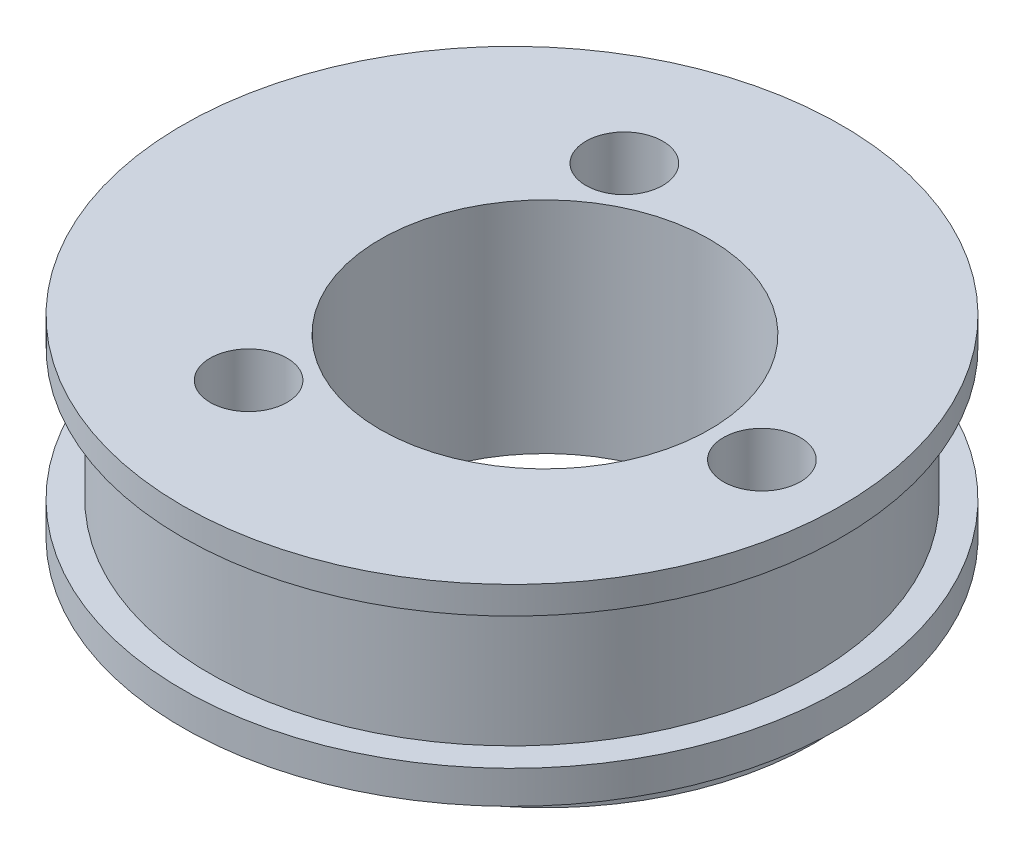
ISO-10303-21;
HEADER;
FILE_DESCRIPTION(('STEP AP214'),'2;1');
FILE_NAME('part.step','',(''),(''),'','','');
FILE_SCHEMA(('AUTOMOTIVE_DESIGN { 1 0 10303 214 1 1 1 1 }'));
ENDSEC;
DATA;
#1=APPLICATION_CONTEXT('core data for automotive mechanical design processes');
#2=APPLICATION_PROTOCOL_DEFINITION('international standard','automotive_design',2000,#1);
#3=PRODUCT_CONTEXT('',#1,'mechanical');
#4=PRODUCT('Part','Part','',(#3));
#5=PRODUCT_RELATED_PRODUCT_CATEGORY('part','',(#4));
#6=PRODUCT_DEFINITION_FORMATION('','',#4);
#7=PRODUCT_DEFINITION_CONTEXT('part definition',#1,'design');
#8=PRODUCT_DEFINITION('design','',#6,#7);
#9=PRODUCT_DEFINITION_SHAPE('','',#8);
#10=(LENGTH_UNIT() NAMED_UNIT(*) SI_UNIT(.MILLI.,.METRE.));
#11=(NAMED_UNIT(*) PLANE_ANGLE_UNIT() SI_UNIT($,.RADIAN.));
#12=(NAMED_UNIT(*) SI_UNIT($,.STERADIAN.) SOLID_ANGLE_UNIT());
#13=UNCERTAINTY_MEASURE_WITH_UNIT(LENGTH_MEASURE(1.E-05),#10,'distance_accuracy_value','');
#14=(GEOMETRIC_REPRESENTATION_CONTEXT(3) GLOBAL_UNCERTAINTY_ASSIGNED_CONTEXT((#13)) GLOBAL_UNIT_ASSIGNED_CONTEXT((#10,
#11,#12)) REPRESENTATION_CONTEXT('',''));
#15=CARTESIAN_POINT('',(0.,0.,0.));
#16=DIRECTION('',(0.,0.,1.));
#17=DIRECTION('',(1.,0.,0.));
#18=AXIS2_PLACEMENT_3D('',#15,#16,#17);
#19=CARTESIAN_POINT('',(0.,3.,0.));
#20=DIRECTION('',(0.,-1.,0.));
#21=DIRECTION('',(0.,0.,-1.));
#22=AXIS2_PLACEMENT_3D('',#19,#20,#21);
#23=PLANE('',#22);
#24=CARTESIAN_POINT('',(0.,3.,0.));
#25=DIRECTION('',(0.,-1.,0.));
#26=DIRECTION('',(0.,0.,-1.));
#27=AXIS2_PLACEMENT_3D('',#24,#25,#26);
#28=CIRCLE('',#27,27.5);
#29=CARTESIAN_POINT('',(0.,3.,-27.5));
#30=VERTEX_POINT('',#29);
#31=EDGE_CURVE('E70',#30,#30,#28,.T.);
#32=ORIENTED_EDGE('',*,*,#31,.T.);
#33=EDGE_LOOP('',(#32));
#34=FACE_BOUND('',#33,.T.);
#35=CARTESIAN_POINT('',(0.,3.,0.));
#36=DIRECTION('',(0.,-1.,0.));
#37=DIRECTION('',(0.,0.,-1.));
#38=AXIS2_PLACEMENT_3D('',#35,#36,#37);
#39=CIRCLE('',#38,30.);
#40=CARTESIAN_POINT('',(0.,3.,-30.));
#41=VERTEX_POINT('',#40);
#42=EDGE_CURVE('E58',#41,#41,#39,.T.);
#43=ORIENTED_EDGE('',*,*,#42,.F.);
#44=EDGE_LOOP('',(#43));
#45=FACE_BOUND('',#44,.T.);
#46=ADVANCED_FACE('F41',(#34,#45),#23,.F.);
#47=CARTESIAN_POINT('',(3.,-2.5,0.));
#48=DIRECTION('',(0.,1.,0.));
#49=DIRECTION('',(0.,0.,1.));
#50=AXIS2_PLACEMENT_3D('',#47,#48,#49);
#51=CYLINDRICAL_SURFACE('',#50,24.5);
#52=CARTESIAN_POINT('',(3.,-2.5,0.));
#53=DIRECTION('',(0.,-1.,0.));
#54=DIRECTION('',(0.,0.,-1.));
#55=AXIS2_PLACEMENT_3D('',#52,#53,#54);
#56=CIRCLE('',#55,24.5);
#57=CARTESIAN_POINT('',(3.,-2.5,-24.5));
#58=VERTEX_POINT('',#57);
#59=EDGE_CURVE('E48',#58,#58,#56,.T.);
#60=ORIENTED_EDGE('',*,*,#59,.F.);
#61=EDGE_LOOP('',(#60));
#62=FACE_BOUND('',#61,.T.);
#63=CARTESIAN_POINT('',(3.,0.,0.));
#64=DIRECTION('',(0.,-1.,0.));
#65=DIRECTION('',(0.,0.,-1.));
#66=AXIS2_PLACEMENT_3D('',#63,#64,#65);
#67=CIRCLE('',#66,24.5);
#68=CARTESIAN_POINT('',(3.,0.,-24.5));
#69=VERTEX_POINT('',#68);
#70=EDGE_CURVE('E44',#69,#69,#67,.T.);
#71=ORIENTED_EDGE('',*,*,#70,.T.);
#72=EDGE_LOOP('',(#71));
#73=FACE_BOUND('',#72,.T.);
#74=ADVANCED_FACE('F125',(#62,#73),#51,.T.);
#75=CARTESIAN_POINT('',(0.,-2.5,0.));
#76=DIRECTION('',(0.,-1.,0.));
#77=DIRECTION('',(0.,0.,-1.));
#78=AXIS2_PLACEMENT_3D('',#75,#76,#77);
#79=PLANE('',#78);
#80=CARTESIAN_POINT('',(-6.87499999999996,-2.5,-17.1040017247427));
#81=DIRECTION('',(0.,1.,0.));
#82=DIRECTION('',(0.,0.,1.));
#83=AXIS2_PLACEMENT_3D('',#80,#81,#82);
#84=CIRCLE('',#83,2.);
#85=CARTESIAN_POINT('',(-6.87499999999996,-2.5,-15.1040017247427));
#86=VERTEX_POINT('',#85);
#87=EDGE_CURVE('E61',#86,#86,#84,.T.);
#88=ORIENTED_EDGE('',*,*,#87,.T.);
#89=EDGE_LOOP('',(#88));
#90=FACE_BOUND('',#89,.T.);
#91=CARTESIAN_POINT('',(-6.8750000000002,-2.5,17.1040017247425));
#92=DIRECTION('',(0.,1.,0.));
#93=DIRECTION('',(0.,0.,1.));
#94=AXIS2_PLACEMENT_3D('',#91,#92,#93);
#95=CIRCLE('',#94,2.);
#96=CARTESIAN_POINT('',(-6.8750000000002,-2.5,19.1040017247425));
#97=VERTEX_POINT('',#96);
#98=EDGE_CURVE('E57',#97,#97,#95,.T.);
#99=ORIENTED_EDGE('',*,*,#98,.T.);
#100=EDGE_LOOP('',(#99));
#101=FACE_BOUND('',#100,.T.);
#102=CARTESIAN_POINT('',(22.75,-2.5,1.39413705213259E-13));
#103=DIRECTION('',(0.,1.,0.));
#104=DIRECTION('',(0.,0.,1.));
#105=AXIS2_PLACEMENT_3D('',#102,#103,#104);
#106=CIRCLE('',#105,2.);
#107=CARTESIAN_POINT('',(22.75,-2.5,2.00000000000014));
#108=VERTEX_POINT('',#107);
#109=EDGE_CURVE('E54',#108,#108,#106,.T.);
#110=ORIENTED_EDGE('',*,*,#109,.T.);
#111=EDGE_LOOP('',(#110));
#112=FACE_BOUND('',#111,.T.);
#113=ORIENTED_EDGE('',*,*,#59,.T.);
#114=EDGE_LOOP('',(#113));
#115=FACE_BOUND('',#114,.T.);
#116=CARTESIAN_POINT('',(3.,-2.5,0.));
#117=DIRECTION('',(0.,-1.,0.));
#118=DIRECTION('',(0.,0.,-1.));
#119=AXIS2_PLACEMENT_3D('',#116,#117,#118);
#120=CIRCLE('',#119,15.);
#121=CARTESIAN_POINT('',(3.,-2.5,-15.));
#122=VERTEX_POINT('',#121);
#123=EDGE_CURVE('E11',#122,#122,#120,.F.);
#124=ORIENTED_EDGE('',*,*,#123,.T.);
#125=EDGE_LOOP('',(#124));
#126=FACE_BOUND('',#125,.T.);
#127=ADVANCED_FACE('F149',(#90,#101,#112,#115,#126),#79,.T.);
#128=CARTESIAN_POINT('',(3.,0.,0.));
#129=DIRECTION('',(0.,1.,0.));
#130=DIRECTION('',(0.,0.,1.));
#131=AXIS2_PLACEMENT_3D('',#128,#129,#130);
#132=CYLINDRICAL_SURFACE('',#131,15.);
#133=ORIENTED_EDGE('',*,*,#123,.F.);
#134=EDGE_LOOP('',(#133));
#135=FACE_BOUND('',#134,.T.);
#136=CARTESIAN_POINT('',(3.,17.5,0.));
#137=DIRECTION('',(0.,1.,0.));
#138=DIRECTION('',(0.,0.,1.));
#139=AXIS2_PLACEMENT_3D('',#136,#137,#138);
#140=CIRCLE('',#139,15.);
#141=CARTESIAN_POINT('',(3.,17.5,15.));
#142=VERTEX_POINT('',#141);
#143=EDGE_CURVE('E77',#142,#142,#140,.F.);
#144=ORIENTED_EDGE('',*,*,#143,.F.);
#145=EDGE_LOOP('',(#144));
#146=FACE_BOUND('',#145,.T.);
#147=ADVANCED_FACE('F145',(#135,#146),#132,.F.);
#148=CARTESIAN_POINT('',(-6.87499999999996,-2.5,-17.1040017247427));
#149=DIRECTION('',(0.,1.,0.));
#150=DIRECTION('',(0.,0.,1.));
#151=AXIS2_PLACEMENT_3D('',#148,#149,#150);
#152=CYLINDRICAL_SURFACE('',#151,2.);
#153=ORIENTED_EDGE('',*,*,#87,.F.);
#154=EDGE_LOOP('',(#153));
#155=FACE_BOUND('',#154,.T.);
#156=CARTESIAN_POINT('',(-6.87499999999996,11.,-17.1040017247427));
#157=DIRECTION('',(0.,1.,0.));
#158=DIRECTION('',(0.,0.,1.));
#159=AXIS2_PLACEMENT_3D('',#156,#157,#158);
#160=CIRCLE('',#159,2.);
#161=CARTESIAN_POINT('',(-6.87499999999996,11.,-15.1040017247427));
#162=VERTEX_POINT('',#161);
#163=EDGE_CURVE('E92',#162,#162,#160,.F.);
#164=ORIENTED_EDGE('',*,*,#163,.F.);
#165=EDGE_LOOP('',(#164));
#166=FACE_BOUND('',#165,.T.);
#167=ADVANCED_FACE('F148',(#155,#166),#152,.F.);
#168=CARTESIAN_POINT('',(-6.8750000000002,-2.5,17.1040017247425));
#169=DIRECTION('',(0.,1.,0.));
#170=DIRECTION('',(0.,0.,1.));
#171=AXIS2_PLACEMENT_3D('',#168,#169,#170);
#172=CYLINDRICAL_SURFACE('',#171,2.);
#173=ORIENTED_EDGE('',*,*,#98,.F.);
#174=EDGE_LOOP('',(#173));
#175=FACE_BOUND('',#174,.T.);
#176=CARTESIAN_POINT('',(-6.8750000000002,11.,17.1040017247425));
#177=DIRECTION('',(0.,1.,0.));
#178=DIRECTION('',(0.,0.,1.));
#179=AXIS2_PLACEMENT_3D('',#176,#177,#178);
#180=CIRCLE('',#179,2.);
#181=CARTESIAN_POINT('',(-6.8750000000002,11.,19.1040017247425));
#182=VERTEX_POINT('',#181);
#183=EDGE_CURVE('E89',#182,#182,#180,.F.);
#184=ORIENTED_EDGE('',*,*,#183,.F.);
#185=EDGE_LOOP('',(#184));
#186=FACE_BOUND('',#185,.T.);
#187=ADVANCED_FACE('F140',(#175,#186),#172,.F.);
#188=CARTESIAN_POINT('',(22.75,-2.5,1.39413705213259E-13));
#189=DIRECTION('',(0.,1.,0.));
#190=DIRECTION('',(0.,0.,1.));
#191=AXIS2_PLACEMENT_3D('',#188,#189,#190);
#192=CYLINDRICAL_SURFACE('',#191,2.);
#193=ORIENTED_EDGE('',*,*,#109,.F.);
#194=EDGE_LOOP('',(#193));
#195=FACE_BOUND('',#194,.T.);
#196=CARTESIAN_POINT('',(22.75,11.,1.39413705213259E-13));
#197=DIRECTION('',(0.,1.,0.));
#198=DIRECTION('',(0.,0.,1.));
#199=AXIS2_PLACEMENT_3D('',#196,#197,#198);
#200=CIRCLE('',#199,2.);
#201=CARTESIAN_POINT('',(22.75,11.,2.00000000000014));
#202=VERTEX_POINT('',#201);
#203=EDGE_CURVE('E99',#202,#202,#200,.F.);
#204=ORIENTED_EDGE('',*,*,#203,.F.);
#205=EDGE_LOOP('',(#204));
#206=FACE_BOUND('',#205,.T.);
#207=ADVANCED_FACE('F135',(#195,#206),#192,.F.);
#208=CARTESIAN_POINT('',(0.,0.,0.));
#209=DIRECTION('',(0.,1.,0.));
#210=DIRECTION('',(0.,0.,1.));
#211=AXIS2_PLACEMENT_3D('',#208,#209,#210);
#212=PLANE('',#211);
#213=ORIENTED_EDGE('',*,*,#70,.F.);
#214=EDGE_LOOP('',(#213));
#215=FACE_BOUND('',#214,.T.);
#216=CARTESIAN_POINT('',(0.,0.,0.));
#217=DIRECTION('',(0.,-1.,0.));
#218=DIRECTION('',(0.,0.,-1.));
#219=AXIS2_PLACEMENT_3D('',#216,#217,#218);
#220=CIRCLE('',#219,30.);
#221=CARTESIAN_POINT('',(0.,0.,-30.));
#222=VERTEX_POINT('',#221);
#223=EDGE_CURVE('E64',#222,#222,#220,.T.);
#224=ORIENTED_EDGE('',*,*,#223,.T.);
#225=EDGE_LOOP('',(#224));
#226=FACE_BOUND('',#225,.T.);
#227=ADVANCED_FACE('F130',(#215,#226),#212,.F.);
#228=CARTESIAN_POINT('',(0.,3.,0.));
#229=DIRECTION('',(0.,-1.,0.));
#230=DIRECTION('',(0.,0.,-1.));
#231=AXIS2_PLACEMENT_3D('',#228,#229,#230);
#232=CYLINDRICAL_SURFACE('',#231,30.);
#233=ORIENTED_EDGE('',*,*,#42,.T.);
#234=EDGE_LOOP('',(#233));
#235=FACE_BOUND('',#234,.T.);
#236=ORIENTED_EDGE('',*,*,#223,.F.);
#237=EDGE_LOOP('',(#236));
#238=FACE_BOUND('',#237,.T.);
#239=ADVANCED_FACE('F119',(#235,#238),#232,.T.);
#240=CARTESIAN_POINT('',(0.,15.,0.));
#241=DIRECTION('',(0.,-1.,0.));
#242=DIRECTION('',(0.,0.,-1.));
#243=AXIS2_PLACEMENT_3D('',#240,#241,#242);
#244=CYLINDRICAL_SURFACE('',#243,27.5);
#245=CARTESIAN_POINT('',(0.,15.,0.));
#246=DIRECTION('',(0.,1.,0.));
#247=DIRECTION('',(0.,0.,1.));
#248=AXIS2_PLACEMENT_3D('',#245,#246,#247);
#249=CIRCLE('',#248,27.5);
#250=CARTESIAN_POINT('',(0.,15.,27.5));
#251=VERTEX_POINT('',#250);
#252=EDGE_CURVE('E73',#251,#251,#249,.T.);
#253=ORIENTED_EDGE('',*,*,#252,.F.);
#254=EDGE_LOOP('',(#253));
#255=FACE_BOUND('',#254,.T.);
#256=ORIENTED_EDGE('',*,*,#31,.F.);
#257=EDGE_LOOP('',(#256));
#258=FACE_BOUND('',#257,.T.);
#259=ADVANCED_FACE('F115',(#255,#258),#244,.T.);
#260=CARTESIAN_POINT('',(-6.87499999999996,11.,-17.1040017247427));
#261=DIRECTION('',(0.,1.,0.));
#262=DIRECTION('',(0.,0.,1.));
#263=AXIS2_PLACEMENT_3D('',#260,#261,#262);
#264=CYLINDRICAL_SURFACE('',#263,3.5);
#265=CARTESIAN_POINT('',(-6.87499999999996,11.,-17.1040017247427));
#266=DIRECTION('',(0.,1.,0.));
#267=DIRECTION('',(0.,0.,1.));
#268=AXIS2_PLACEMENT_3D('',#265,#266,#267);
#269=CIRCLE('',#268,3.5);
#270=CARTESIAN_POINT('',(-6.87499999999996,11.,-13.6040017247427));
#271=VERTEX_POINT('',#270);
#272=EDGE_CURVE('E96',#271,#271,#269,.T.);
#273=ORIENTED_EDGE('',*,*,#272,.F.);
#274=EDGE_LOOP('',(#273));
#275=FACE_BOUND('',#274,.T.);
#276=CARTESIAN_POINT('',(-6.87499999999996,17.5,-17.1040017247427));
#277=DIRECTION('',(0.,1.,0.));
#278=DIRECTION('',(0.,0.,1.));
#279=AXIS2_PLACEMENT_3D('',#276,#277,#278);
#280=CIRCLE('',#279,3.5);
#281=CARTESIAN_POINT('',(-6.87499999999996,17.5,-13.6040017247427));
#282=VERTEX_POINT('',#281);
#283=EDGE_CURVE('E83',#282,#282,#280,.F.);
#284=ORIENTED_EDGE('',*,*,#283,.F.);
#285=EDGE_LOOP('',(#284));
#286=FACE_BOUND('',#285,.T.);
#287=ADVANCED_FACE('F118',(#275,#286),#264,.F.);
#288=CARTESIAN_POINT('',(0.,11.,0.));
#289=DIRECTION('',(0.,1.,0.));
#290=DIRECTION('',(0.,0.,1.));
#291=AXIS2_PLACEMENT_3D('',#288,#289,#290);
#292=PLANE('',#291);
#293=ORIENTED_EDGE('',*,*,#163,.T.);
#294=EDGE_LOOP('',(#293));
#295=FACE_BOUND('',#294,.T.);
#296=ORIENTED_EDGE('',*,*,#272,.T.);
#297=EDGE_LOOP('',(#296));
#298=FACE_BOUND('',#297,.T.);
#299=ADVANCED_FACE('F174',(#295,#298),#292,.T.);
#300=CARTESIAN_POINT('',(-6.87499999999923,11.,17.1040017247426));
#301=DIRECTION('',(0.,1.,0.));
#302=DIRECTION('',(0.,0.,1.));
#303=AXIS2_PLACEMENT_3D('',#300,#301,#302);
#304=CYLINDRICAL_SURFACE('',#303,3.5);
#305=CARTESIAN_POINT('',(-6.87499999999923,11.,17.1040017247426));
#306=DIRECTION('',(0.,1.,0.));
#307=DIRECTION('',(0.,0.,1.));
#308=AXIS2_PLACEMENT_3D('',#305,#306,#307);
#309=CIRCLE('',#308,3.5);
#310=CARTESIAN_POINT('',(-6.87499999999923,11.,20.6040017247426));
#311=VERTEX_POINT('',#310);
#312=EDGE_CURVE('E102',#311,#311,#309,.T.);
#313=ORIENTED_EDGE('',*,*,#312,.F.);
#314=EDGE_LOOP('',(#313));
#315=FACE_BOUND('',#314,.T.);
#316=CARTESIAN_POINT('',(-6.87499999999923,17.5,17.1040017247426));
#317=DIRECTION('',(0.,1.,0.));
#318=DIRECTION('',(0.,0.,1.));
#319=AXIS2_PLACEMENT_3D('',#316,#317,#318);
#320=CIRCLE('',#319,3.5);
#321=CARTESIAN_POINT('',(-6.87499999999923,17.5,20.6040017247426));
#322=VERTEX_POINT('',#321);
#323=EDGE_CURVE('E80',#322,#322,#320,.F.);
#324=ORIENTED_EDGE('',*,*,#323,.F.);
#325=EDGE_LOOP('',(#324));
#326=FACE_BOUND('',#325,.T.);
#327=ADVANCED_FACE('F177',(#315,#326),#304,.F.);
#328=CARTESIAN_POINT('',(0.,11.,0.));
#329=DIRECTION('',(0.,1.,0.));
#330=DIRECTION('',(0.,0.,1.));
#331=AXIS2_PLACEMENT_3D('',#328,#329,#330);
#332=PLANE('',#331);
#333=ORIENTED_EDGE('',*,*,#183,.T.);
#334=EDGE_LOOP('',(#333));
#335=FACE_BOUND('',#334,.T.);
#336=ORIENTED_EDGE('',*,*,#312,.T.);
#337=EDGE_LOOP('',(#336));
#338=FACE_BOUND('',#337,.T.);
#339=ADVANCED_FACE('F188',(#335,#338),#332,.T.);
#340=CARTESIAN_POINT('',(22.7500000000005,11.,-6.83481049534862E-13));
#341=DIRECTION('',(0.,1.,0.));
#342=DIRECTION('',(0.,0.,1.));
#343=AXIS2_PLACEMENT_3D('',#340,#341,#342);
#344=CYLINDRICAL_SURFACE('',#343,3.5);
#345=CARTESIAN_POINT('',(22.7500000000005,11.,-6.83481049534862E-13));
#346=DIRECTION('',(0.,1.,0.));
#347=DIRECTION('',(0.,0.,1.));
#348=AXIS2_PLACEMENT_3D('',#345,#346,#347);
#349=CIRCLE('',#348,3.5);
#350=CARTESIAN_POINT('',(22.7500000000005,11.,3.49999999999932));
#351=VERTEX_POINT('',#350);
#352=EDGE_CURVE('E95',#351,#351,#349,.T.);
#353=ORIENTED_EDGE('',*,*,#352,.F.);
#354=EDGE_LOOP('',(#353));
#355=FACE_BOUND('',#354,.T.);
#356=CARTESIAN_POINT('',(22.7500000000005,17.5,-6.83481049534862E-13));
#357=DIRECTION('',(0.,1.,0.));
#358=DIRECTION('',(0.,0.,1.));
#359=AXIS2_PLACEMENT_3D('',#356,#357,#358);
#360=CIRCLE('',#359,3.5);
#361=CARTESIAN_POINT('',(22.7500000000005,17.5,3.49999999999932));
#362=VERTEX_POINT('',#361);
#363=EDGE_CURVE('E74',#362,#362,#360,.F.);
#364=ORIENTED_EDGE('',*,*,#363,.F.);
#365=EDGE_LOOP('',(#364));
#366=FACE_BOUND('',#365,.T.);
#367=ADVANCED_FACE('F184',(#355,#366),#344,.F.);
#368=CARTESIAN_POINT('',(0.,11.,0.));
#369=DIRECTION('',(0.,1.,0.));
#370=DIRECTION('',(0.,0.,1.));
#371=AXIS2_PLACEMENT_3D('',#368,#369,#370);
#372=PLANE('',#371);
#373=ORIENTED_EDGE('',*,*,#203,.T.);
#374=EDGE_LOOP('',(#373));
#375=FACE_BOUND('',#374,.T.);
#376=ORIENTED_EDGE('',*,*,#352,.T.);
#377=EDGE_LOOP('',(#376));
#378=FACE_BOUND('',#377,.T.);
#379=ADVANCED_FACE('F172',(#375,#378),#372,.T.);
#380=CARTESIAN_POINT('',(0.,17.5,0.));
#381=DIRECTION('',(0.,-1.,0.));
#382=DIRECTION('',(0.,0.,-1.));
#383=AXIS2_PLACEMENT_3D('',#380,#381,#382);
#384=CYLINDRICAL_SURFACE('',#383,30.);
#385=CARTESIAN_POINT('',(0.,17.5,0.));
#386=DIRECTION('',(0.,1.,0.));
#387=DIRECTION('',(0.,0.,1.));
#388=AXIS2_PLACEMENT_3D('',#385,#386,#387);
#389=CIRCLE('',#388,30.);
#390=CARTESIAN_POINT('',(0.,17.5,30.));
#391=VERTEX_POINT('',#390);
#392=EDGE_CURVE('E86',#391,#391,#389,.T.);
#393=ORIENTED_EDGE('',*,*,#392,.F.);
#394=EDGE_LOOP('',(#393));
#395=FACE_BOUND('',#394,.T.);
#396=CARTESIAN_POINT('',(0.,15.,0.));
#397=DIRECTION('',(0.,1.,0.));
#398=DIRECTION('',(0.,0.,1.));
#399=AXIS2_PLACEMENT_3D('',#396,#397,#398);
#400=CIRCLE('',#399,30.);
#401=CARTESIAN_POINT('',(0.,15.,30.));
#402=VERTEX_POINT('',#401);
#403=EDGE_CURVE('E67',#402,#402,#400,.T.);
#404=ORIENTED_EDGE('',*,*,#403,.T.);
#405=EDGE_LOOP('',(#404));
#406=FACE_BOUND('',#405,.T.);
#407=ADVANCED_FACE('F166',(#395,#406),#384,.T.);
#408=CARTESIAN_POINT('',(0.,17.5,0.));
#409=DIRECTION('',(0.,1.,0.));
#410=DIRECTION('',(0.,0.,1.));
#411=AXIS2_PLACEMENT_3D('',#408,#409,#410);
#412=PLANE('',#411);
#413=ORIENTED_EDGE('',*,*,#363,.T.);
#414=EDGE_LOOP('',(#413));
#415=FACE_BOUND('',#414,.T.);
#416=ORIENTED_EDGE('',*,*,#143,.T.);
#417=EDGE_LOOP('',(#416));
#418=FACE_BOUND('',#417,.T.);
#419=ORIENTED_EDGE('',*,*,#323,.T.);
#420=EDGE_LOOP('',(#419));
#421=FACE_BOUND('',#420,.T.);
#422=ORIENTED_EDGE('',*,*,#283,.T.);
#423=EDGE_LOOP('',(#422));
#424=FACE_BOUND('',#423,.T.);
#425=ORIENTED_EDGE('',*,*,#392,.T.);
#426=EDGE_LOOP('',(#425));
#427=FACE_BOUND('',#426,.T.);
#428=ADVANCED_FACE('F163',(#415,#418,#421,#424,#427),#412,.T.);
#429=CARTESIAN_POINT('',(0.,15.,0.));
#430=DIRECTION('',(0.,1.,0.));
#431=DIRECTION('',(0.,0.,1.));
#432=AXIS2_PLACEMENT_3D('',#429,#430,#431);
#433=PLANE('',#432);
#434=ORIENTED_EDGE('',*,*,#252,.T.);
#435=EDGE_LOOP('',(#434));
#436=FACE_BOUND('',#435,.T.);
#437=ORIENTED_EDGE('',*,*,#403,.F.);
#438=EDGE_LOOP('',(#437));
#439=FACE_BOUND('',#438,.T.);
#440=ADVANCED_FACE('F112',(#436,#439),#433,.F.);
#441=CLOSED_SHELL('',(#46,#74,#127,#147,#167,#187,#207,#227,#239,#259,#287,#299,#327,#339,#367,
#379,#407,#428,#440));
#442=MANIFOLD_SOLID_BREP('B2',#441);
#443=ADVANCED_BREP_SHAPE_REPRESENTATION('',(#18,#442),#14);
#444=SHAPE_DEFINITION_REPRESENTATION(#9,#443);
ENDSEC;
END-ISO-10303-21;
